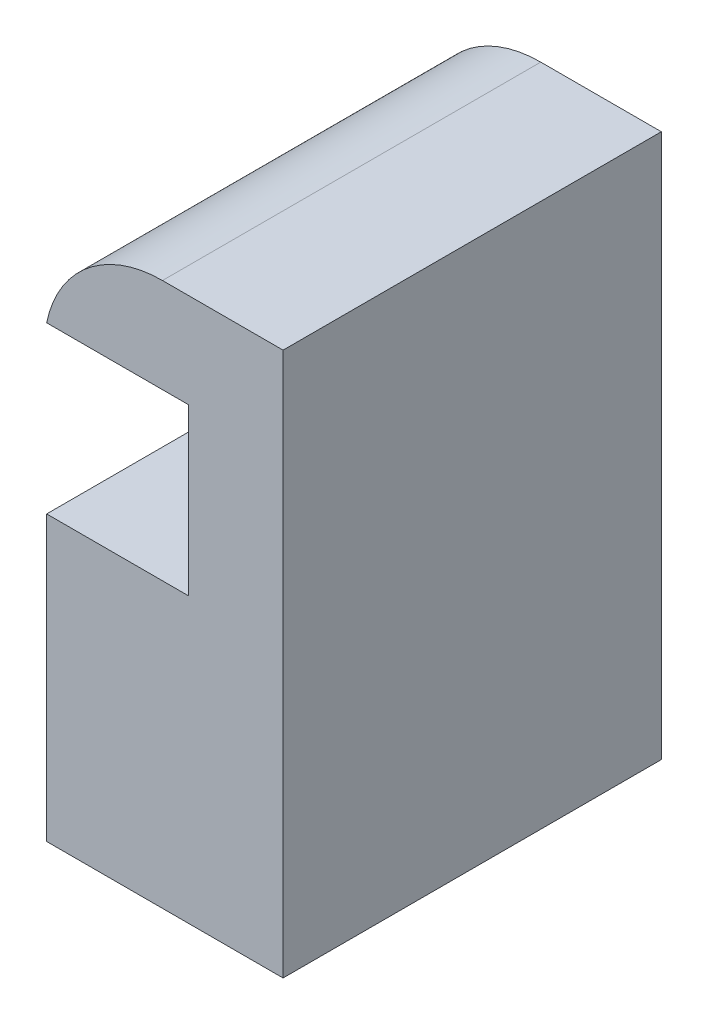
ISO-10303-21;
HEADER;
FILE_DESCRIPTION(('STEP AP214'),'2;1');
FILE_NAME('part.step','',(''),(''),'','','');
FILE_SCHEMA(('AUTOMOTIVE_DESIGN { 1 0 10303 214 1 1 1 1 }'));
ENDSEC;
DATA;
#1=APPLICATION_CONTEXT('core data for automotive mechanical design processes');
#2=APPLICATION_PROTOCOL_DEFINITION('international standard','automotive_design',2000,#1);
#3=PRODUCT_CONTEXT('',#1,'mechanical');
#4=PRODUCT('Part','Part','',(#3));
#5=PRODUCT_RELATED_PRODUCT_CATEGORY('part','',(#4));
#6=PRODUCT_DEFINITION_FORMATION('','',#4);
#7=PRODUCT_DEFINITION_CONTEXT('part definition',#1,'design');
#8=PRODUCT_DEFINITION('design','',#6,#7);
#9=PRODUCT_DEFINITION_SHAPE('','',#8);
#10=(LENGTH_UNIT() NAMED_UNIT(*) SI_UNIT(.MILLI.,.METRE.));
#11=(NAMED_UNIT(*) PLANE_ANGLE_UNIT() SI_UNIT($,.RADIAN.));
#12=(NAMED_UNIT(*) SI_UNIT($,.STERADIAN.) SOLID_ANGLE_UNIT());
#13=UNCERTAINTY_MEASURE_WITH_UNIT(LENGTH_MEASURE(1.E-05),#10,'distance_accuracy_value','');
#14=(GEOMETRIC_REPRESENTATION_CONTEXT(3) GLOBAL_UNCERTAINTY_ASSIGNED_CONTEXT((#13)) GLOBAL_UNIT_ASSIGNED_CONTEXT((#10,
#11,#12)) REPRESENTATION_CONTEXT('',''));
#15=CARTESIAN_POINT('',(0.,0.,0.));
#16=DIRECTION('',(0.,0.,1.));
#17=DIRECTION('',(1.,0.,0.));
#18=AXIS2_PLACEMENT_3D('',#15,#16,#17);
#19=CARTESIAN_POINT('',(0.,12.,16.));
#20=DIRECTION('',(1.,0.,0.));
#21=DIRECTION('',(0.,1.,0.));
#22=AXIS2_PLACEMENT_3D('',#19,#20,#21);
#23=PLANE('',#22);
#24=DIRECTION('',(0.,-1.,0.));
#25=VECTOR('',#24,1.);
#26=CARTESIAN_POINT('',(0.,12.,0.));
#27=LINE('',#26,#25);
#28=CARTESIAN_POINT('',(0.,12.,0.));
#29=VERTEX_POINT('',#28);
#30=CARTESIAN_POINT('',(0.,0.,0.));
#31=VERTEX_POINT('',#30);
#32=EDGE_CURVE('E125',#29,#31,#27,.T.);
#33=ORIENTED_EDGE('',*,*,#32,.T.);
#34=DIRECTION('',(0.,0.,-1.));
#35=VECTOR('',#34,1.);
#36=CARTESIAN_POINT('',(0.,0.,16.));
#37=LINE('',#36,#35);
#38=CARTESIAN_POINT('',(0.,0.,16.));
#39=VERTEX_POINT('',#38);
#40=EDGE_CURVE('E106',#39,#31,#37,.T.);
#41=ORIENTED_EDGE('',*,*,#40,.F.);
#42=DIRECTION('',(0.,-1.,0.));
#43=VECTOR('',#42,1.);
#44=CARTESIAN_POINT('',(0.,12.,16.));
#45=LINE('',#44,#43);
#46=CARTESIAN_POINT('',(0.,12.,16.));
#47=VERTEX_POINT('',#46);
#48=EDGE_CURVE('E113',#47,#39,#45,.T.);
#49=ORIENTED_EDGE('',*,*,#48,.F.);
#50=DIRECTION('',(0.,0.,-1.));
#51=VECTOR('',#50,1.);
#52=CARTESIAN_POINT('',(0.,12.,16.));
#53=LINE('',#52,#51);
#54=EDGE_CURVE('E142',#47,#29,#53,.T.);
#55=ORIENTED_EDGE('',*,*,#54,.T.);
#56=EDGE_LOOP('',(#33,#41,#49,#55));
#57=FACE_BOUND('',#56,.T.);
#58=ADVANCED_FACE('F37',(#57),#23,.F.);
#59=CARTESIAN_POINT('',(0.,0.,16.));
#60=DIRECTION('',(0.,1.,0.));
#61=DIRECTION('',(0.,0.,1.));
#62=AXIS2_PLACEMENT_3D('',#59,#60,#61);
#63=PLANE('',#62);
#64=DIRECTION('',(1.,0.,0.));
#65=VECTOR('',#64,1.);
#66=CARTESIAN_POINT('',(0.,0.,0.));
#67=LINE('',#66,#65);
#68=CARTESIAN_POINT('',(10.,0.,0.));
#69=VERTEX_POINT('',#68);
#70=EDGE_CURVE('E153',#31,#69,#67,.T.);
#71=ORIENTED_EDGE('',*,*,#70,.T.);
#72=DIRECTION('',(0.,0.,-1.));
#73=VECTOR('',#72,1.);
#74=CARTESIAN_POINT('',(10.,0.,16.));
#75=LINE('',#74,#73);
#76=CARTESIAN_POINT('',(10.,0.,16.));
#77=VERTEX_POINT('',#76);
#78=EDGE_CURVE('E109',#77,#69,#75,.T.);
#79=ORIENTED_EDGE('',*,*,#78,.F.);
#80=DIRECTION('',(1.,0.,0.));
#81=VECTOR('',#80,1.);
#82=CARTESIAN_POINT('',(0.,0.,16.));
#83=LINE('',#82,#81);
#84=EDGE_CURVE('E102',#39,#77,#83,.T.);
#85=ORIENTED_EDGE('',*,*,#84,.F.);
#86=ORIENTED_EDGE('',*,*,#40,.T.);
#87=EDGE_LOOP('',(#71,#79,#85,#86));
#88=FACE_BOUND('',#87,.T.);
#89=ADVANCED_FACE('F104',(#88),#63,.F.);
#90=CARTESIAN_POINT('',(10.,0.,16.));
#91=DIRECTION('',(-1.,0.,0.));
#92=DIRECTION('',(0.,0.,1.));
#93=AXIS2_PLACEMENT_3D('',#90,#91,#92);
#94=PLANE('',#93);
#95=DIRECTION('',(0.,1.,0.));
#96=VECTOR('',#95,1.);
#97=CARTESIAN_POINT('',(10.,0.,0.));
#98=LINE('',#97,#96);
#99=CARTESIAN_POINT('',(10.,23.,0.));
#100=VERTEX_POINT('',#99);
#101=EDGE_CURVE('E151',#69,#100,#98,.T.);
#102=ORIENTED_EDGE('',*,*,#101,.T.);
#103=DIRECTION('',(0.,0.,-1.));
#104=VECTOR('',#103,1.);
#105=CARTESIAN_POINT('',(10.,23.,16.));
#106=LINE('',#105,#104);
#107=CARTESIAN_POINT('',(10.,23.,16.));
#108=VERTEX_POINT('',#107);
#109=EDGE_CURVE('E128',#108,#100,#106,.T.);
#110=ORIENTED_EDGE('',*,*,#109,.F.);
#111=DIRECTION('',(0.,1.,0.));
#112=VECTOR('',#111,1.);
#113=CARTESIAN_POINT('',(10.,0.,16.));
#114=LINE('',#113,#112);
#115=EDGE_CURVE('E112',#77,#108,#114,.T.);
#116=ORIENTED_EDGE('',*,*,#115,.F.);
#117=ORIENTED_EDGE('',*,*,#78,.T.);
#118=EDGE_LOOP('',(#102,#110,#116,#117));
#119=FACE_BOUND('',#118,.T.);
#120=ADVANCED_FACE('F166',(#119),#94,.F.);
#121=CARTESIAN_POINT('',(10.,23.,16.));
#122=DIRECTION('',(0.,-1.,0.));
#123=DIRECTION('',(0.,0.,-1.));
#124=AXIS2_PLACEMENT_3D('',#121,#122,#123);
#125=PLANE('',#124);
#126=DIRECTION('',(-1.,0.,0.));
#127=VECTOR('',#126,1.);
#128=CARTESIAN_POINT('',(10.,23.,0.));
#129=LINE('',#128,#127);
#130=CARTESIAN_POINT('',(4.89897948556636,23.,0.));
#131=VERTEX_POINT('',#130);
#132=EDGE_CURVE('E149',#100,#131,#129,.T.);
#133=ORIENTED_EDGE('',*,*,#132,.T.);
#134=DIRECTION('',(0.,0.,1.));
#135=VECTOR('',#134,1.);
#136=CARTESIAN_POINT('',(4.89897948556636,23.,16.));
#137=LINE('',#136,#135);
#138=CARTESIAN_POINT('',(4.89897948556636,23.,16.));
#139=VERTEX_POINT('',#138);
#140=EDGE_CURVE('E45',#131,#139,#137,.T.);
#141=ORIENTED_EDGE('',*,*,#140,.T.);
#142=DIRECTION('',(-1.,0.,0.));
#143=VECTOR('',#142,1.);
#144=CARTESIAN_POINT('',(10.,23.,16.));
#145=LINE('',#144,#143);
#146=EDGE_CURVE('E161',#108,#139,#145,.T.);
#147=ORIENTED_EDGE('',*,*,#146,.F.);
#148=ORIENTED_EDGE('',*,*,#109,.T.);
#149=EDGE_LOOP('',(#133,#141,#147,#148));
#150=FACE_BOUND('',#149,.T.);
#151=ADVANCED_FACE('F168',(#150),#125,.F.);
#152=CARTESIAN_POINT('',(6.,19.,16.));
#153=DIRECTION('',(0.,1.,0.));
#154=DIRECTION('',(-1.,0.,0.));
#155=AXIS2_PLACEMENT_3D('',#152,#153,#154);
#156=PLANE('',#155);
#157=DIRECTION('',(1.,0.,0.));
#158=VECTOR('',#157,1.);
#159=CARTESIAN_POINT('',(6.,19.,0.));
#160=LINE('',#159,#158);
#161=CARTESIAN_POINT('',(0.,19.,0.));
#162=VERTEX_POINT('',#161);
#163=CARTESIAN_POINT('',(6.,19.,0.));
#164=VERTEX_POINT('',#163);
#165=EDGE_CURVE('E147',#162,#164,#160,.T.);
#166=ORIENTED_EDGE('',*,*,#165,.T.);
#167=DIRECTION('',(0.,0.,-1.));
#168=VECTOR('',#167,1.);
#169=CARTESIAN_POINT('',(6.,19.,16.));
#170=LINE('',#169,#168);
#171=CARTESIAN_POINT('',(6.,19.,16.));
#172=VERTEX_POINT('',#171);
#173=EDGE_CURVE('E136',#172,#164,#170,.T.);
#174=ORIENTED_EDGE('',*,*,#173,.F.);
#175=DIRECTION('',(1.,0.,0.));
#176=VECTOR('',#175,1.);
#177=CARTESIAN_POINT('',(6.,19.,16.));
#178=LINE('',#177,#176);
#179=CARTESIAN_POINT('',(0.,19.,16.));
#180=VERTEX_POINT('',#179);
#181=EDGE_CURVE('E159',#180,#172,#178,.T.);
#182=ORIENTED_EDGE('',*,*,#181,.F.);
#183=DIRECTION('',(0.,0.,-1.));
#184=VECTOR('',#183,1.);
#185=CARTESIAN_POINT('',(0.,19.,16.));
#186=LINE('',#185,#184);
#187=EDGE_CURVE('E133',#180,#162,#186,.T.);
#188=ORIENTED_EDGE('',*,*,#187,.T.);
#189=EDGE_LOOP('',(#166,#174,#182,#188));
#190=FACE_BOUND('',#189,.T.);
#191=ADVANCED_FACE('F170',(#190),#156,.F.);
#192=CARTESIAN_POINT('',(6.,12.,16.));
#193=DIRECTION('',(1.,0.,0.));
#194=DIRECTION('',(0.,0.,-1.));
#195=AXIS2_PLACEMENT_3D('',#192,#193,#194);
#196=PLANE('',#195);
#197=DIRECTION('',(0.,-1.,0.));
#198=VECTOR('',#197,1.);
#199=CARTESIAN_POINT('',(6.,12.,0.));
#200=LINE('',#199,#198);
#201=CARTESIAN_POINT('',(6.,12.,0.));
#202=VERTEX_POINT('',#201);
#203=EDGE_CURVE('E145',#164,#202,#200,.T.);
#204=ORIENTED_EDGE('',*,*,#203,.T.);
#205=DIRECTION('',(0.,0.,-1.));
#206=VECTOR('',#205,1.);
#207=CARTESIAN_POINT('',(6.,12.,16.));
#208=LINE('',#207,#206);
#209=CARTESIAN_POINT('',(6.,12.,16.));
#210=VERTEX_POINT('',#209);
#211=EDGE_CURVE('E139',#210,#202,#208,.T.);
#212=ORIENTED_EDGE('',*,*,#211,.F.);
#213=DIRECTION('',(0.,-1.,0.));
#214=VECTOR('',#213,1.);
#215=CARTESIAN_POINT('',(6.,12.,16.));
#216=LINE('',#215,#214);
#217=EDGE_CURVE('E157',#172,#210,#216,.T.);
#218=ORIENTED_EDGE('',*,*,#217,.F.);
#219=ORIENTED_EDGE('',*,*,#173,.T.);
#220=EDGE_LOOP('',(#204,#212,#218,#219));
#221=FACE_BOUND('',#220,.T.);
#222=ADVANCED_FACE('F176',(#221),#196,.F.);
#223=CARTESIAN_POINT('',(0.,12.,16.));
#224=DIRECTION('',(0.,-1.,0.));
#225=DIRECTION('',(0.,0.,-1.));
#226=AXIS2_PLACEMENT_3D('',#223,#224,#225);
#227=PLANE('',#226);
#228=DIRECTION('',(-1.,0.,0.));
#229=VECTOR('',#228,1.);
#230=CARTESIAN_POINT('',(0.,12.,0.));
#231=LINE('',#230,#229);
#232=EDGE_CURVE('E122',#202,#29,#231,.T.);
#233=ORIENTED_EDGE('',*,*,#232,.T.);
#234=ORIENTED_EDGE('',*,*,#54,.F.);
#235=DIRECTION('',(-1.,0.,0.));
#236=VECTOR('',#235,1.);
#237=CARTESIAN_POINT('',(0.,12.,16.));
#238=LINE('',#237,#236);
#239=EDGE_CURVE('E118',#210,#47,#238,.T.);
#240=ORIENTED_EDGE('',*,*,#239,.F.);
#241=ORIENTED_EDGE('',*,*,#211,.T.);
#242=EDGE_LOOP('',(#233,#234,#240,#241));
#243=FACE_BOUND('',#242,.T.);
#244=ADVANCED_FACE('F202',(#243),#227,.F.);
#245=CARTESIAN_POINT('',(0.,0.,16.));
#246=DIRECTION('',(0.,0.,1.));
#247=DIRECTION('',(1.,0.,0.));
#248=AXIS2_PLACEMENT_3D('',#245,#246,#247);
#249=PLANE('',#248);
#250=ORIENTED_EDGE('',*,*,#146,.T.);
#251=CARTESIAN_POINT('',(4.89897948556636,18.,16.));
#252=DIRECTION('',(0.,0.,1.));
#253=DIRECTION('',(1.,0.,0.));
#254=AXIS2_PLACEMENT_3D('',#251,#252,#253);
#255=CIRCLE('',#254,5.);
#256=EDGE_CURVE('E11',#139,#180,#255,.T.);
#257=ORIENTED_EDGE('',*,*,#256,.T.);
#258=ORIENTED_EDGE('',*,*,#181,.T.);
#259=ORIENTED_EDGE('',*,*,#217,.T.);
#260=ORIENTED_EDGE('',*,*,#239,.T.);
#261=ORIENTED_EDGE('',*,*,#48,.T.);
#262=ORIENTED_EDGE('',*,*,#84,.T.);
#263=ORIENTED_EDGE('',*,*,#115,.T.);
#264=EDGE_LOOP('',(#250,#257,#258,#259,#260,#261,#262,#263));
#265=FACE_BOUND('',#264,.T.);
#266=ADVANCED_FACE('F116',(#265),#249,.T.);
#267=CARTESIAN_POINT('',(0.,0.,0.));
#268=DIRECTION('',(0.,0.,1.));
#269=DIRECTION('',(1.,0.,0.));
#270=AXIS2_PLACEMENT_3D('',#267,#268,#269);
#271=PLANE('',#270);
#272=ORIENTED_EDGE('',*,*,#165,.F.);
#273=CARTESIAN_POINT('',(4.89897948556636,18.,0.));
#274=DIRECTION('',(0.,0.,1.));
#275=DIRECTION('',(1.,0.,0.));
#276=AXIS2_PLACEMENT_3D('',#273,#274,#275);
#277=CIRCLE('',#276,5.);
#278=EDGE_CURVE('E59',#162,#131,#277,.F.);
#279=ORIENTED_EDGE('',*,*,#278,.T.);
#280=ORIENTED_EDGE('',*,*,#132,.F.);
#281=ORIENTED_EDGE('',*,*,#101,.F.);
#282=ORIENTED_EDGE('',*,*,#70,.F.);
#283=ORIENTED_EDGE('',*,*,#32,.F.);
#284=ORIENTED_EDGE('',*,*,#232,.F.);
#285=ORIENTED_EDGE('',*,*,#203,.F.);
#286=EDGE_LOOP('',(#272,#279,#280,#281,#282,#283,#284,#285));
#287=FACE_BOUND('',#286,.T.);
#288=ADVANCED_FACE('F234',(#287),#271,.F.);
#289=CARTESIAN_POINT('',(4.89897948556636,18.,16.));
#290=DIRECTION('',(0.,0.,1.));
#291=DIRECTION('',(1.,0.,0.));
#292=AXIS2_PLACEMENT_3D('',#289,#290,#291);
#293=CYLINDRICAL_SURFACE('',#292,5.);
#294=ORIENTED_EDGE('',*,*,#256,.F.);
#295=ORIENTED_EDGE('',*,*,#140,.F.);
#296=ORIENTED_EDGE('',*,*,#278,.F.);
#297=ORIENTED_EDGE('',*,*,#187,.F.);
#298=EDGE_LOOP('',(#294,#295,#296,#297));
#299=FACE_BOUND('',#298,.T.);
#300=ADVANCED_FACE('F39',(#299),#293,.T.);
#301=CLOSED_SHELL('',(#58,#89,#120,#151,#191,#222,#244,#266,#288,#300));
#302=MANIFOLD_SOLID_BREP('B2',#301);
#303=ADVANCED_BREP_SHAPE_REPRESENTATION('',(#18,#302),#14);
#304=SHAPE_DEFINITION_REPRESENTATION(#9,#303);
ENDSEC;
END-ISO-10303-21;
